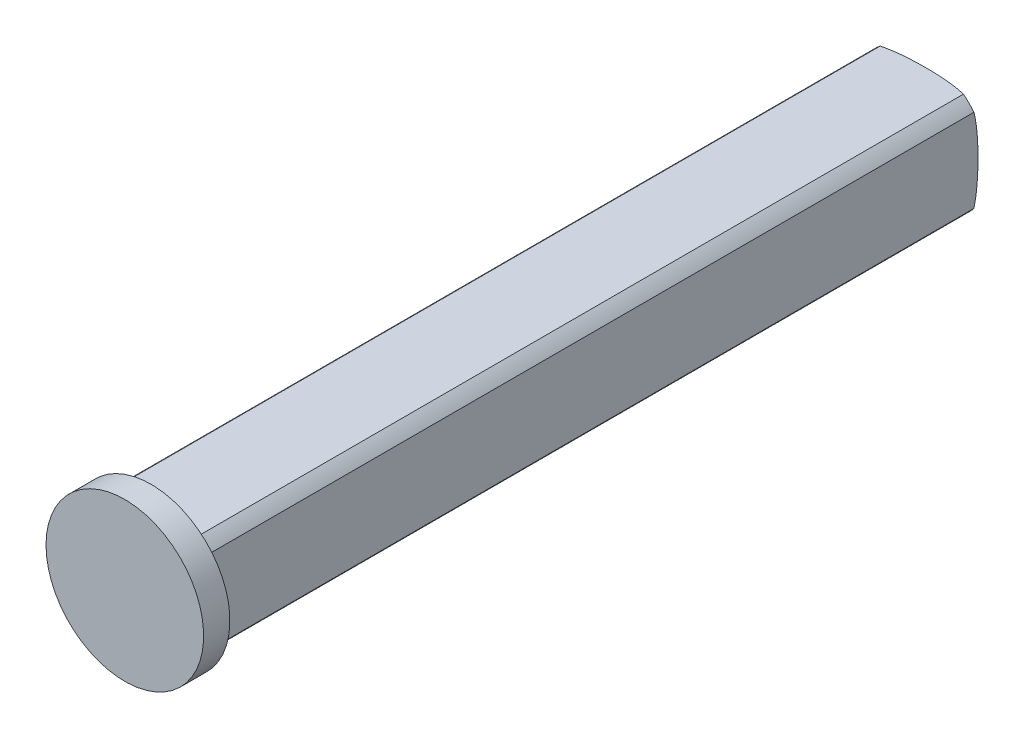
ISO-10303-21;
HEADER;
FILE_DESCRIPTION(('STEP AP214'),'2;1');
FILE_NAME('part.step','',(''),(''),'','','');
FILE_SCHEMA(('AUTOMOTIVE_DESIGN { 1 0 10303 214 1 1 1 1 }'));
ENDSEC;
DATA;
#1=APPLICATION_CONTEXT('core data for automotive mechanical design processes');
#2=APPLICATION_PROTOCOL_DEFINITION('international standard','automotive_design',2000,#1);
#3=PRODUCT_CONTEXT('',#1,'mechanical');
#4=PRODUCT('Part','Part','',(#3));
#5=PRODUCT_RELATED_PRODUCT_CATEGORY('part','',(#4));
#6=PRODUCT_DEFINITION_FORMATION('','',#4);
#7=PRODUCT_DEFINITION_CONTEXT('part definition',#1,'design');
#8=PRODUCT_DEFINITION('design','',#6,#7);
#9=PRODUCT_DEFINITION_SHAPE('','',#8);
#10=(LENGTH_UNIT() NAMED_UNIT(*) SI_UNIT(.MILLI.,.METRE.));
#11=(NAMED_UNIT(*) PLANE_ANGLE_UNIT() SI_UNIT($,.RADIAN.));
#12=(NAMED_UNIT(*) SI_UNIT($,.STERADIAN.) SOLID_ANGLE_UNIT());
#13=UNCERTAINTY_MEASURE_WITH_UNIT(LENGTH_MEASURE(1.E-05),#10,'distance_accuracy_value','');
#14=(GEOMETRIC_REPRESENTATION_CONTEXT(3) GLOBAL_UNCERTAINTY_ASSIGNED_CONTEXT((#13)) GLOBAL_UNIT_ASSIGNED_CONTEXT((#10,
#11,#12)) REPRESENTATION_CONTEXT('',''));
#15=CARTESIAN_POINT('',(0.,0.,0.));
#16=DIRECTION('',(0.,0.,1.));
#17=DIRECTION('',(1.,0.,0.));
#18=AXIS2_PLACEMENT_3D('',#15,#16,#17);
#19=CARTESIAN_POINT('',(0.,0.,11.811));
#20=DIRECTION('',(0.,0.,1.));
#21=DIRECTION('',(1.,0.,0.));
#22=AXIS2_PLACEMENT_3D('',#19,#20,#21);
#23=PLANE('',#22);
#24=CARTESIAN_POINT('',(0.,0.,11.811));
#25=DIRECTION('',(0.,0.,1.));
#26=DIRECTION('',(1.,0.,0.));
#27=AXIS2_PLACEMENT_3D('',#24,#25,#26);
#28=CIRCLE('',#27,2.032);
#29=CARTESIAN_POINT('',(-1.5875,-1.26841150657032,11.811));
#30=VERTEX_POINT('',#29);
#31=CARTESIAN_POINT('',(-1.26841150657032,-1.5875,11.811));
#32=VERTEX_POINT('',#31);
#33=EDGE_CURVE('E273',#30,#32,#28,.T.);
#34=ORIENTED_EDGE('',*,*,#33,.T.);
#35=DIRECTION('',(1.,0.,0.));
#36=VECTOR('',#35,1.);
#37=CARTESIAN_POINT('',(-1.5875,-1.5875,11.811));
#38=LINE('',#37,#36);
#39=CARTESIAN_POINT('',(1.26841150657032,-1.5875,11.811));
#40=VERTEX_POINT('',#39);
#41=EDGE_CURVE('E101',#32,#40,#38,.T.);
#42=ORIENTED_EDGE('',*,*,#41,.T.);
#43=CARTESIAN_POINT('',(0.,0.,11.811));
#44=DIRECTION('',(0.,0.,1.));
#45=DIRECTION('',(1.,0.,0.));
#46=AXIS2_PLACEMENT_3D('',#43,#44,#45);
#47=CIRCLE('',#46,2.032);
#48=CARTESIAN_POINT('',(1.5875,-1.26841150657032,11.811));
#49=VERTEX_POINT('',#48);
#50=EDGE_CURVE('E270',#40,#49,#47,.T.);
#51=ORIENTED_EDGE('',*,*,#50,.T.);
#52=DIRECTION('',(0.,1.,0.));
#53=VECTOR('',#52,1.);
#54=CARTESIAN_POINT('',(1.5875,-1.5875,11.811));
#55=LINE('',#54,#53);
#56=CARTESIAN_POINT('',(1.5875,1.26841150657032,11.811));
#57=VERTEX_POINT('',#56);
#58=EDGE_CURVE('E98',#49,#57,#55,.T.);
#59=ORIENTED_EDGE('',*,*,#58,.T.);
#60=CARTESIAN_POINT('',(0.,0.,11.811));
#61=DIRECTION('',(0.,0.,1.));
#62=DIRECTION('',(1.,0.,0.));
#63=AXIS2_PLACEMENT_3D('',#60,#61,#62);
#64=CIRCLE('',#63,2.032);
#65=CARTESIAN_POINT('',(1.26841150657032,1.5875,11.811));
#66=VERTEX_POINT('',#65);
#67=EDGE_CURVE('E10',#57,#66,#64,.T.);
#68=ORIENTED_EDGE('',*,*,#67,.T.);
#69=DIRECTION('',(-1.,0.,0.));
#70=VECTOR('',#69,1.);
#71=CARTESIAN_POINT('',(-1.5875,1.5875,11.811));
#72=LINE('',#71,#70);
#73=CARTESIAN_POINT('',(-1.26841150657032,1.5875,11.811));
#74=VERTEX_POINT('',#73);
#75=EDGE_CURVE('E268',#66,#74,#72,.T.);
#76=ORIENTED_EDGE('',*,*,#75,.T.);
#77=CARTESIAN_POINT('',(0.,0.,11.811));
#78=DIRECTION('',(0.,0.,1.));
#79=DIRECTION('',(1.,0.,0.));
#80=AXIS2_PLACEMENT_3D('',#77,#78,#79);
#81=CIRCLE('',#80,2.032);
#82=CARTESIAN_POINT('',(-1.5875,1.26841150657032,11.811));
#83=VERTEX_POINT('',#82);
#84=EDGE_CURVE('E26',#74,#83,#81,.T.);
#85=ORIENTED_EDGE('',*,*,#84,.T.);
#86=DIRECTION('',(0.,-1.,0.));
#87=VECTOR('',#86,1.);
#88=CARTESIAN_POINT('',(-1.5875,-1.5875,11.811));
#89=LINE('',#88,#87);
#90=EDGE_CURVE('E234',#83,#30,#89,.T.);
#91=ORIENTED_EDGE('',*,*,#90,.T.);
#92=EDGE_LOOP('',(#34,#42,#51,#59,#68,#76,#85,#91));
#93=FACE_BOUND('',#92,.T.);
#94=CARTESIAN_POINT('',(0.,0.,11.811));
#95=DIRECTION('',(0.,0.,1.));
#96=DIRECTION('',(1.,0.,0.));
#97=AXIS2_PLACEMENT_3D('',#94,#95,#96);
#98=CIRCLE('',#97,2.4);
#99=CARTESIAN_POINT('',(-2.4,0.,11.811));
#100=VERTEX_POINT('',#99);
#101=EDGE_CURVE('E303',#100,#100,#98,.T.);
#102=ORIENTED_EDGE('',*,*,#101,.F.);
#103=EDGE_LOOP('',(#102));
#104=FACE_BOUND('',#103,.T.);
#105=ADVANCED_FACE('F16',(#93,#104),#23,.F.);
#106=CARTESIAN_POINT('',(0.,0.,12.611));
#107=DIRECTION('',(0.,0.,1.));
#108=DIRECTION('',(1.,0.,0.));
#109=AXIS2_PLACEMENT_3D('',#106,#107,#108);
#110=PLANE('',#109);
#111=CARTESIAN_POINT('',(0.,0.,12.611));
#112=DIRECTION('',(0.,0.,1.));
#113=DIRECTION('',(1.,0.,0.));
#114=AXIS2_PLACEMENT_3D('',#111,#112,#113);
#115=CIRCLE('',#114,2.4);
#116=CARTESIAN_POINT('',(-2.4,0.,12.611));
#117=VERTEX_POINT('',#116);
#118=EDGE_CURVE('E301',#117,#117,#115,.T.);
#119=ORIENTED_EDGE('',*,*,#118,.T.);
#120=EDGE_LOOP('',(#119));
#121=FACE_BOUND('',#120,.T.);
#122=ADVANCED_FACE('F136',(#121),#110,.T.);
#123=CARTESIAN_POINT('',(0.,0.,-11.811));
#124=DIRECTION('',(0.,0.,-1.));
#125=DIRECTION('',(1.,0.,0.));
#126=AXIS2_PLACEMENT_3D('',#123,#124,#125);
#127=CYLINDRICAL_SURFACE('',#126,2.032);
#128=DIRECTION('',(0.,0.,-1.));
#129=VECTOR('',#128,1.);
#130=CARTESIAN_POINT('',(1.5875,1.26841150657032,-11.811));
#131=LINE('',#130,#129);
#132=CARTESIAN_POINT('',(1.5875,1.26841150657032,-11.659919142098));
#133=VERTEX_POINT('',#132);
#134=EDGE_CURVE('E100',#57,#133,#131,.T.);
#135=ORIENTED_EDGE('',*,*,#134,.T.);
#136=CARTESIAN_POINT('',(0.,0.,-11.659919142098));
#137=DIRECTION('',(0.,0.,1.));
#138=DIRECTION('',(1.,0.,0.));
#139=AXIS2_PLACEMENT_3D('',#136,#137,#138);
#140=CIRCLE('',#139,2.032);
#141=CARTESIAN_POINT('',(1.26841150657032,1.5875,-11.659919142098));
#142=VERTEX_POINT('',#141);
#143=EDGE_CURVE('E118',#133,#142,#140,.T.);
#144=ORIENTED_EDGE('',*,*,#143,.T.);
#145=DIRECTION('',(0.,0.,1.));
#146=VECTOR('',#145,1.);
#147=CARTESIAN_POINT('',(1.26841150657032,1.5875,-11.811));
#148=LINE('',#147,#146);
#149=EDGE_CURVE('E267',#142,#66,#148,.T.);
#150=ORIENTED_EDGE('',*,*,#149,.T.);
#151=ORIENTED_EDGE('',*,*,#67,.F.);
#152=EDGE_LOOP('',(#135,#144,#150,#151));
#153=FACE_BOUND('',#152,.T.);
#154=ADVANCED_FACE('F280',(#153),#127,.T.);
#155=CARTESIAN_POINT('',(0.,0.,-11.811));
#156=DIRECTION('',(0.,0.,-1.));
#157=DIRECTION('',(1.,0.,0.));
#158=AXIS2_PLACEMENT_3D('',#155,#156,#157);
#159=CYLINDRICAL_SURFACE('',#158,2.032);
#160=DIRECTION('',(0.,0.,1.));
#161=VECTOR('',#160,1.);
#162=CARTESIAN_POINT('',(-1.5875,1.26841150657032,-11.811));
#163=LINE('',#162,#161);
#164=CARTESIAN_POINT('',(-1.5875,1.26841150657032,-11.659919142098));
#165=VERTEX_POINT('',#164);
#166=EDGE_CURVE('E235',#165,#83,#163,.T.);
#167=ORIENTED_EDGE('',*,*,#166,.T.);
#168=ORIENTED_EDGE('',*,*,#84,.F.);
#169=DIRECTION('',(0.,0.,-1.));
#170=VECTOR('',#169,1.);
#171=CARTESIAN_POINT('',(-1.26841150657032,1.5875,-11.811));
#172=LINE('',#171,#170);
#173=CARTESIAN_POINT('',(-1.26841150657032,1.5875,-11.659919142098));
#174=VERTEX_POINT('',#173);
#175=EDGE_CURVE('E271',#74,#174,#172,.T.);
#176=ORIENTED_EDGE('',*,*,#175,.T.);
#177=CARTESIAN_POINT('',(0.,0.,-11.659919142098));
#178=DIRECTION('',(0.,0.,1.));
#179=DIRECTION('',(1.,0.,0.));
#180=AXIS2_PLACEMENT_3D('',#177,#178,#179);
#181=CIRCLE('',#180,2.032);
#182=EDGE_CURVE('E218',#174,#165,#181,.T.);
#183=ORIENTED_EDGE('',*,*,#182,.T.);
#184=EDGE_LOOP('',(#167,#168,#176,#183));
#185=FACE_BOUND('',#184,.T.);
#186=ADVANCED_FACE('F175',(#185),#159,.T.);
#187=CARTESIAN_POINT('',(0.,0.,-11.811));
#188=DIRECTION('',(0.,0.,-1.));
#189=DIRECTION('',(1.,0.,0.));
#190=AXIS2_PLACEMENT_3D('',#187,#188,#189);
#191=CYLINDRICAL_SURFACE('',#190,2.032);
#192=DIRECTION('',(0.,0.,-1.));
#193=VECTOR('',#192,1.);
#194=CARTESIAN_POINT('',(-1.5875,-1.26841150657032,-11.811));
#195=LINE('',#194,#193);
#196=CARTESIAN_POINT('',(-1.5875,-1.26841150657032,-11.659919142098));
#197=VERTEX_POINT('',#196);
#198=EDGE_CURVE('E232',#30,#197,#195,.T.);
#199=ORIENTED_EDGE('',*,*,#198,.T.);
#200=CARTESIAN_POINT('',(0.,0.,-11.659919142098));
#201=DIRECTION('',(0.,0.,1.));
#202=DIRECTION('',(1.,0.,0.));
#203=AXIS2_PLACEMENT_3D('',#200,#201,#202);
#204=CIRCLE('',#203,2.032);
#205=CARTESIAN_POINT('',(-1.26841150657032,-1.5875,-11.659919142098));
#206=VERTEX_POINT('',#205);
#207=EDGE_CURVE('E220',#197,#206,#204,.T.);
#208=ORIENTED_EDGE('',*,*,#207,.T.);
#209=DIRECTION('',(0.,0.,1.));
#210=VECTOR('',#209,1.);
#211=CARTESIAN_POINT('',(-1.26841150657032,-1.5875,-11.811));
#212=LINE('',#211,#210);
#213=EDGE_CURVE('E256',#206,#32,#212,.T.);
#214=ORIENTED_EDGE('',*,*,#213,.T.);
#215=ORIENTED_EDGE('',*,*,#33,.F.);
#216=EDGE_LOOP('',(#199,#208,#214,#215));
#217=FACE_BOUND('',#216,.T.);
#218=ADVANCED_FACE('F283',(#217),#191,.T.);
#219=CARTESIAN_POINT('',(0.,0.,-11.811));
#220=DIRECTION('',(0.,0.,-1.));
#221=DIRECTION('',(1.,0.,0.));
#222=AXIS2_PLACEMENT_3D('',#219,#220,#221);
#223=CYLINDRICAL_SURFACE('',#222,2.032);
#224=DIRECTION('',(0.,0.,-1.));
#225=VECTOR('',#224,1.);
#226=CARTESIAN_POINT('',(1.26841150657032,-1.5875,-11.811));
#227=LINE('',#226,#225);
#228=CARTESIAN_POINT('',(1.26841150657032,-1.5875,-11.659919142098));
#229=VERTEX_POINT('',#228);
#230=EDGE_CURVE('E107',#40,#229,#227,.T.);
#231=ORIENTED_EDGE('',*,*,#230,.T.);
#232=CARTESIAN_POINT('',(0.,0.,-11.659919142098));
#233=DIRECTION('',(0.,0.,1.));
#234=DIRECTION('',(1.,0.,0.));
#235=AXIS2_PLACEMENT_3D('',#232,#233,#234);
#236=CIRCLE('',#235,2.032);
#237=CARTESIAN_POINT('',(1.5875,-1.26841150657032,-11.659919142098));
#238=VERTEX_POINT('',#237);
#239=EDGE_CURVE('E104',#229,#238,#236,.T.);
#240=ORIENTED_EDGE('',*,*,#239,.T.);
#241=DIRECTION('',(0.,0.,1.));
#242=VECTOR('',#241,1.);
#243=CARTESIAN_POINT('',(1.5875,-1.26841150657032,-11.811));
#244=LINE('',#243,#242);
#245=EDGE_CURVE('E91',#238,#49,#244,.T.);
#246=ORIENTED_EDGE('',*,*,#245,.T.);
#247=ORIENTED_EDGE('',*,*,#50,.F.);
#248=EDGE_LOOP('',(#231,#240,#246,#247));
#249=FACE_BOUND('',#248,.T.);
#250=ADVANCED_FACE('F105',(#249),#223,.T.);
#251=CARTESIAN_POINT('',(-1.5875,1.5875,-11.811));
#252=DIRECTION('',(0.,0.,-1.));
#253=DIRECTION('',(-1.,0.,0.));
#254=AXIS2_PLACEMENT_3D('',#251,#252,#253);
#255=PLANE('',#254);
#256=CARTESIAN_POINT('',(0.,0.,-11.811));
#257=DIRECTION('',(0.,0.,1.));
#258=DIRECTION('',(1.,0.,0.));
#259=AXIS2_PLACEMENT_3D('',#256,#257,#258);
#260=CIRCLE('',#259,1.24506403026729);
#261=CARTESIAN_POINT('',(1.24506403026729,0.,-11.811));
#262=VERTEX_POINT('',#261);
#263=EDGE_CURVE('E119',#262,#262,#260,.T.);
#264=ORIENTED_EDGE('',*,*,#263,.F.);
#265=EDGE_LOOP('',(#264));
#266=FACE_BOUND('',#265,.T.);
#267=ADVANCED_FACE('F141',(#266),#255,.T.);
#268=CARTESIAN_POINT('',(-1.5875,1.5875,11.811));
#269=DIRECTION('',(0.,-1.,0.));
#270=DIRECTION('',(0.,0.,-1.));
#271=AXIS2_PLACEMENT_3D('',#268,#269,#270);
#272=PLANE('',#271);
#273=ORIENTED_EDGE('',*,*,#149,.F.);
#274=CARTESIAN_POINT('',(1.26822755475094,1.5875,-11.6591730808506));
#275=CARTESIAN_POINT('',(0.76525320470967,1.5875,-11.7831884308976));
#276=CARTESIAN_POINT('',(-5.71471667650241E-05,1.5875,-11.7832273615577));
#277=CARTESIAN_POINT('',(-0.773430771427462,1.5875,-11.7832667023893));
#278=CARTESIAN_POINT('',(-1.26836383212022,1.5875,-11.659728143743));
#279=B_SPLINE_CURVE_WITH_KNOTS('',2,(#274,#275,#276,#277,#278),.UNSPECIFIED.,.F.,.F.,(3,2,3),
(0.,0.5,1.),.UNSPECIFIED.);
#280=EDGE_CURVE('E158',#142,#174,#279,.T.);
#281=ORIENTED_EDGE('',*,*,#280,.T.);
#282=ORIENTED_EDGE('',*,*,#175,.F.);
#283=ORIENTED_EDGE('',*,*,#75,.F.);
#284=EDGE_LOOP('',(#273,#281,#282,#283));
#285=FACE_BOUND('',#284,.T.);
#286=ADVANCED_FACE('F135',(#285),#272,.F.);
#287=CARTESIAN_POINT('',(1.5875,-1.5875,11.811));
#288=DIRECTION('',(-1.,0.,0.));
#289=DIRECTION('',(0.,0.,1.));
#290=AXIS2_PLACEMENT_3D('',#287,#288,#289);
#291=PLANE('',#290);
#292=ORIENTED_EDGE('',*,*,#245,.F.);
#293=CARTESIAN_POINT('',(1.5875,-1.26825225373947,-11.6592842267921));
#294=CARTESIAN_POINT('',(1.5875,-0.774252826154652,-11.7831917881807));
#295=CARTESIAN_POINT('',(1.5875,0.,-11.7832273616928));
#296=CARTESIAN_POINT('',(1.5875,0.773969226413115,-11.7832629221748));
#297=CARTESIAN_POINT('',(1.5875,1.26825225373947,-11.6592842267921));
#298=B_SPLINE_CURVE_WITH_KNOTS('',2,(#293,#294,#295,#296,#297),.UNSPECIFIED.,.F.,.F.,(3,2,3),
(0.,0.5,1.),.UNSPECIFIED.);
#299=EDGE_CURVE('E96',#238,#133,#298,.T.);
#300=ORIENTED_EDGE('',*,*,#299,.T.);
#301=ORIENTED_EDGE('',*,*,#134,.F.);
#302=ORIENTED_EDGE('',*,*,#58,.F.);
#303=EDGE_LOOP('',(#292,#300,#301,#302));
#304=FACE_BOUND('',#303,.T.);
#305=ADVANCED_FACE('F93',(#304),#291,.F.);
#306=CARTESIAN_POINT('',(-1.5875,-1.5875,11.811));
#307=DIRECTION('',(0.,1.,0.));
#308=DIRECTION('',(0.,0.,1.));
#309=AXIS2_PLACEMENT_3D('',#306,#307,#308);
#310=PLANE('',#309);
#311=ORIENTED_EDGE('',*,*,#213,.F.);
#312=CARTESIAN_POINT('',(-1.26825225373947,-1.5875,-11.6592842267921));
#313=CARTESIAN_POINT('',(-0.774252826154652,-1.5875,-11.7831917881807));
#314=CARTESIAN_POINT('',(0.,-1.5875,-11.7832273616928));
#315=CARTESIAN_POINT('',(0.773969226413115,-1.5875,-11.7832629221748));
#316=CARTESIAN_POINT('',(1.26825225373947,-1.5875,-11.6592842267921));
#317=B_SPLINE_CURVE_WITH_KNOTS('',2,(#312,#313,#314,#315,#316),.UNSPECIFIED.,.F.,.F.,(3,2,3),
(0.,0.5,1.),.UNSPECIFIED.);
#318=EDGE_CURVE('E111',#206,#229,#317,.T.);
#319=ORIENTED_EDGE('',*,*,#318,.T.);
#320=ORIENTED_EDGE('',*,*,#230,.F.);
#321=ORIENTED_EDGE('',*,*,#41,.F.);
#322=EDGE_LOOP('',(#311,#319,#320,#321));
#323=FACE_BOUND('',#322,.T.);
#324=ADVANCED_FACE('F134',(#323),#310,.F.);
#325=CARTESIAN_POINT('',(-1.5875,-1.5875,11.811));
#326=DIRECTION('',(1.,0.,0.));
#327=DIRECTION('',(0.,0.,-1.));
#328=AXIS2_PLACEMENT_3D('',#325,#326,#327);
#329=PLANE('',#328);
#330=ORIENTED_EDGE('',*,*,#166,.F.);
#331=CARTESIAN_POINT('',(-1.5875,1.26836383212028,-11.659728143743));
#332=CARTESIAN_POINT('',(-1.5875,0.77375757888123,-11.7831851290919));
#333=CARTESIAN_POINT('',(-1.5875,5.71471667949481E-05,-11.7832273615577));
#334=CARTESIAN_POINT('',(-1.5875,-0.764925957821306,-11.7832691181879));
#335=CARTESIAN_POINT('',(-1.5875,-1.26822755475093,-11.6591730808506));
#336=B_SPLINE_CURVE_WITH_KNOTS('',2,(#331,#332,#333,#334,#335),.UNSPECIFIED.,.F.,.F.,(3,2,3),
(0.,0.5,1.),.UNSPECIFIED.);
#337=EDGE_CURVE('E216',#165,#197,#336,.T.);
#338=ORIENTED_EDGE('',*,*,#337,.T.);
#339=ORIENTED_EDGE('',*,*,#198,.F.);
#340=ORIENTED_EDGE('',*,*,#90,.F.);
#341=EDGE_LOOP('',(#330,#338,#339,#340));
#342=FACE_BOUND('',#341,.T.);
#343=ADVANCED_FACE('F174',(#342),#329,.F.);
#344=CARTESIAN_POINT('',(0.,0.,-9.686));
#345=DIRECTION('',(0.,0.,1.));
#346=DIRECTION('',(1.,0.,0.));
#347=AXIS2_PLACEMENT_3D('',#344,#345,#346);
#348=DEGENERATE_TOROIDAL_SURFACE('',#347,1.24506403026729,2.125,.T.);
#349=ORIENTED_EDGE('',*,*,#299,.F.);
#350=ORIENTED_EDGE('',*,*,#239,.F.);
#351=ORIENTED_EDGE('',*,*,#318,.F.);
#352=ORIENTED_EDGE('',*,*,#207,.F.);
#353=ORIENTED_EDGE('',*,*,#337,.F.);
#354=ORIENTED_EDGE('',*,*,#182,.F.);
#355=ORIENTED_EDGE('',*,*,#280,.F.);
#356=ORIENTED_EDGE('',*,*,#143,.F.);
#357=EDGE_LOOP('',(#349,#350,#351,#352,#353,#354,#355,#356));
#358=FACE_BOUND('',#357,.T.);
#359=ORIENTED_EDGE('',*,*,#263,.T.);
#360=EDGE_LOOP('',(#359));
#361=FACE_BOUND('',#360,.T.);
#362=ADVANCED_FACE('F114',(#358,#361),#348,.T.);
#363=CARTESIAN_POINT('',(0.,0.,12.611));
#364=DIRECTION('',(0.,0.,1.));
#365=DIRECTION('',(-1.,0.,0.));
#366=AXIS2_PLACEMENT_3D('',#363,#364,#365);
#367=CYLINDRICAL_SURFACE('',#366,2.4);
#368=ORIENTED_EDGE('',*,*,#101,.T.);
#369=EDGE_LOOP('',(#368));
#370=FACE_BOUND('',#369,.T.);
#371=ORIENTED_EDGE('',*,*,#118,.F.);
#372=EDGE_LOOP('',(#371));
#373=FACE_BOUND('',#372,.T.);
#374=ADVANCED_FACE('F173',(#370,#373),#367,.T.);
#375=CLOSED_SHELL('',(#105,#122,#154,#186,#218,#250,#267,#286,#305,#324,#343,#362,#374));
#376=MANIFOLD_SOLID_BREP('B1',#375);
#377=ADVANCED_BREP_SHAPE_REPRESENTATION('',(#18,#376),#14);
#378=SHAPE_DEFINITION_REPRESENTATION(#9,#377);
ENDSEC;
END-ISO-10303-21;
